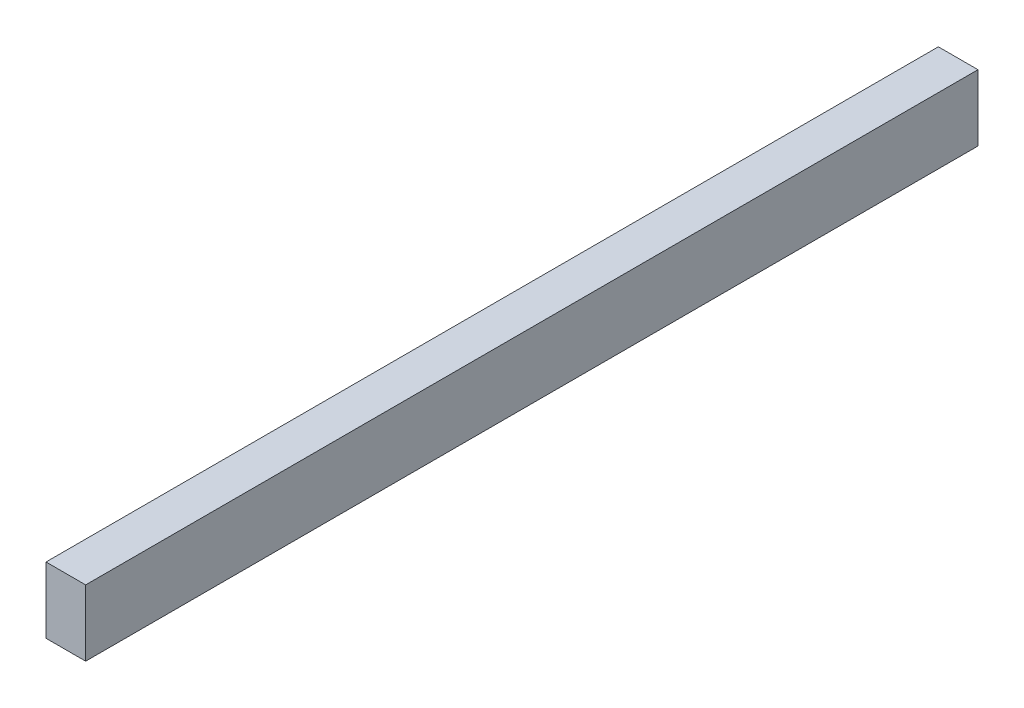
ISO-10303-21;
HEADER;
FILE_DESCRIPTION(('STEP AP214'),'2;1');
FILE_NAME('part.step','',(''),(''),'','','');
FILE_SCHEMA(('AUTOMOTIVE_DESIGN { 1 0 10303 214 1 1 1 1 }'));
ENDSEC;
DATA;
#1=APPLICATION_CONTEXT('core data for automotive mechanical design processes');
#2=APPLICATION_PROTOCOL_DEFINITION('international standard','automotive_design',2000,#1);
#3=PRODUCT_CONTEXT('',#1,'mechanical');
#4=PRODUCT('Part','Part','',(#3));
#5=PRODUCT_RELATED_PRODUCT_CATEGORY('part','',(#4));
#6=PRODUCT_DEFINITION_FORMATION('','',#4);
#7=PRODUCT_DEFINITION_CONTEXT('part definition',#1,'design');
#8=PRODUCT_DEFINITION('design','',#6,#7);
#9=PRODUCT_DEFINITION_SHAPE('','',#8);
#10=(LENGTH_UNIT() NAMED_UNIT(*) SI_UNIT(.MILLI.,.METRE.));
#11=(NAMED_UNIT(*) PLANE_ANGLE_UNIT() SI_UNIT($,.RADIAN.));
#12=(NAMED_UNIT(*) SI_UNIT($,.STERADIAN.) SOLID_ANGLE_UNIT());
#13=UNCERTAINTY_MEASURE_WITH_UNIT(LENGTH_MEASURE(1.E-05),#10,'distance_accuracy_value','');
#14=(GEOMETRIC_REPRESENTATION_CONTEXT(3) GLOBAL_UNCERTAINTY_ASSIGNED_CONTEXT((#13)) GLOBAL_UNIT_ASSIGNED_CONTEXT((#10,
#11,#12)) REPRESENTATION_CONTEXT('',''));
#15=CARTESIAN_POINT('',(0.,0.,0.));
#16=DIRECTION('',(0.,0.,1.));
#17=DIRECTION('',(1.,0.,0.));
#18=AXIS2_PLACEMENT_3D('',#15,#16,#17);
#19=CARTESIAN_POINT('',(-30.,1790.,-705.));
#20=DIRECTION('',(1.,0.,0.));
#21=DIRECTION('',(0.,1.,0.));
#22=AXIS2_PLACEMENT_3D('',#19,#20,#21);
#23=PLANE('',#22);
#24=DIRECTION('',(0.,0.,-1.));
#25=VECTOR('',#24,1.);
#26=CARTESIAN_POINT('',(-30.,1790.,-705.));
#27=LINE('',#26,#25);
#28=CARTESIAN_POINT('',(-30.,1790.,-705.));
#29=VERTEX_POINT('',#28);
#30=CARTESIAN_POINT('',(-30.,1790.,-2055.));
#31=VERTEX_POINT('',#30);
#32=EDGE_CURVE('E73',#29,#31,#27,.T.);
#33=ORIENTED_EDGE('',*,*,#32,.T.);
#34=DIRECTION('',(0.,-1.,0.));
#35=VECTOR('',#34,1.);
#36=CARTESIAN_POINT('',(-30.,1790.,-2055.));
#37=LINE('',#36,#35);
#38=CARTESIAN_POINT('',(-30.,1690.,-2055.));
#39=VERTEX_POINT('',#38);
#40=EDGE_CURVE('E69',#31,#39,#37,.T.);
#41=ORIENTED_EDGE('',*,*,#40,.T.);
#42=DIRECTION('',(0.,0.,-1.));
#43=VECTOR('',#42,1.);
#44=CARTESIAN_POINT('',(-30.,1690.,-705.));
#45=LINE('',#44,#43);
#46=CARTESIAN_POINT('',(-30.,1690.,-705.));
#47=VERTEX_POINT('',#46);
#48=EDGE_CURVE('E11',#47,#39,#45,.T.);
#49=ORIENTED_EDGE('',*,*,#48,.F.);
#50=DIRECTION('',(0.,-1.,0.));
#51=VECTOR('',#50,1.);
#52=CARTESIAN_POINT('',(-30.,1790.,-705.));
#53=LINE('',#52,#51);
#54=EDGE_CURVE('E81',#29,#47,#53,.T.);
#55=ORIENTED_EDGE('',*,*,#54,.F.);
#56=EDGE_LOOP('',(#33,#41,#49,#55));
#57=FACE_BOUND('',#56,.T.);
#58=ADVANCED_FACE('F17',(#57),#23,.F.);
#59=CARTESIAN_POINT('',(-30.,1690.,-705.));
#60=DIRECTION('',(0.,1.,0.));
#61=DIRECTION('',(-1.,0.,0.));
#62=AXIS2_PLACEMENT_3D('',#59,#60,#61);
#63=PLANE('',#62);
#64=ORIENTED_EDGE('',*,*,#48,.T.);
#65=DIRECTION('',(1.,0.,0.));
#66=VECTOR('',#65,1.);
#67=CARTESIAN_POINT('',(-30.,1690.,-2055.));
#68=LINE('',#67,#66);
#69=CARTESIAN_POINT('',(30.,1690.,-2055.));
#70=VERTEX_POINT('',#69);
#71=EDGE_CURVE('E59',#39,#70,#68,.T.);
#72=ORIENTED_EDGE('',*,*,#71,.T.);
#73=DIRECTION('',(0.,0.,-1.));
#74=VECTOR('',#73,1.);
#75=CARTESIAN_POINT('',(30.,1690.,-705.));
#76=LINE('',#75,#74);
#77=CARTESIAN_POINT('',(30.,1690.,-705.));
#78=VERTEX_POINT('',#77);
#79=EDGE_CURVE('E24',#78,#70,#76,.T.);
#80=ORIENTED_EDGE('',*,*,#79,.F.);
#81=DIRECTION('',(1.,0.,0.));
#82=VECTOR('',#81,1.);
#83=CARTESIAN_POINT('',(-30.,1690.,-705.));
#84=LINE('',#83,#82);
#85=EDGE_CURVE('E61',#47,#78,#84,.T.);
#86=ORIENTED_EDGE('',*,*,#85,.F.);
#87=EDGE_LOOP('',(#64,#72,#80,#86));
#88=FACE_BOUND('',#87,.T.);
#89=ADVANCED_FACE('F57',(#88),#63,.F.);
#90=CARTESIAN_POINT('',(30.,1690.,-705.));
#91=DIRECTION('',(-1.,0.,0.));
#92=DIRECTION('',(0.,-1.,0.));
#93=AXIS2_PLACEMENT_3D('',#90,#91,#92);
#94=PLANE('',#93);
#95=ORIENTED_EDGE('',*,*,#79,.T.);
#96=DIRECTION('',(0.,1.,0.));
#97=VECTOR('',#96,1.);
#98=CARTESIAN_POINT('',(30.,1690.,-2055.));
#99=LINE('',#98,#97);
#100=CARTESIAN_POINT('',(30.,1790.,-2055.));
#101=VERTEX_POINT('',#100);
#102=EDGE_CURVE('E71',#70,#101,#99,.T.);
#103=ORIENTED_EDGE('',*,*,#102,.T.);
#104=DIRECTION('',(0.,0.,-1.));
#105=VECTOR('',#104,1.);
#106=CARTESIAN_POINT('',(30.,1790.,-705.));
#107=LINE('',#106,#105);
#108=CARTESIAN_POINT('',(30.,1790.,-705.));
#109=VERTEX_POINT('',#108);
#110=EDGE_CURVE('E86',#109,#101,#107,.T.);
#111=ORIENTED_EDGE('',*,*,#110,.F.);
#112=DIRECTION('',(0.,1.,0.));
#113=VECTOR('',#112,1.);
#114=CARTESIAN_POINT('',(30.,1690.,-705.));
#115=LINE('',#114,#113);
#116=EDGE_CURVE('E36',#78,#109,#115,.T.);
#117=ORIENTED_EDGE('',*,*,#116,.F.);
#118=EDGE_LOOP('',(#95,#103,#111,#117));
#119=FACE_BOUND('',#118,.T.);
#120=ADVANCED_FACE('F88',(#119),#94,.F.);
#121=CARTESIAN_POINT('',(30.,1790.,-705.));
#122=DIRECTION('',(0.,-1.,0.));
#123=DIRECTION('',(1.,0.,0.));
#124=AXIS2_PLACEMENT_3D('',#121,#122,#123);
#125=PLANE('',#124);
#126=ORIENTED_EDGE('',*,*,#110,.T.);
#127=DIRECTION('',(-1.,0.,0.));
#128=VECTOR('',#127,1.);
#129=CARTESIAN_POINT('',(30.,1790.,-2055.));
#130=LINE('',#129,#128);
#131=EDGE_CURVE('E78',#101,#31,#130,.T.);
#132=ORIENTED_EDGE('',*,*,#131,.T.);
#133=ORIENTED_EDGE('',*,*,#32,.F.);
#134=DIRECTION('',(-1.,0.,0.));
#135=VECTOR('',#134,1.);
#136=CARTESIAN_POINT('',(30.,1790.,-705.));
#137=LINE('',#136,#135);
#138=EDGE_CURVE('E31',#109,#29,#137,.T.);
#139=ORIENTED_EDGE('',*,*,#138,.F.);
#140=EDGE_LOOP('',(#126,#132,#133,#139));
#141=FACE_BOUND('',#140,.T.);
#142=ADVANCED_FACE('F90',(#141),#125,.F.);
#143=CARTESIAN_POINT('',(-30.,1690.,-705.));
#144=DIRECTION('',(0.,0.,1.));
#145=DIRECTION('',(0.,-1.,0.));
#146=AXIS2_PLACEMENT_3D('',#143,#144,#145);
#147=PLANE('',#146);
#148=ORIENTED_EDGE('',*,*,#54,.T.);
#149=ORIENTED_EDGE('',*,*,#85,.T.);
#150=ORIENTED_EDGE('',*,*,#116,.T.);
#151=ORIENTED_EDGE('',*,*,#138,.T.);
#152=EDGE_LOOP('',(#148,#149,#150,#151));
#153=FACE_BOUND('',#152,.T.);
#154=ADVANCED_FACE('F91',(#153),#147,.T.);
#155=CARTESIAN_POINT('',(-30.,1690.,-2055.));
#156=DIRECTION('',(0.,0.,1.));
#157=DIRECTION('',(0.,-1.,0.));
#158=AXIS2_PLACEMENT_3D('',#155,#156,#157);
#159=PLANE('',#158);
#160=ORIENTED_EDGE('',*,*,#40,.F.);
#161=ORIENTED_EDGE('',*,*,#131,.F.);
#162=ORIENTED_EDGE('',*,*,#102,.F.);
#163=ORIENTED_EDGE('',*,*,#71,.F.);
#164=EDGE_LOOP('',(#160,#161,#162,#163));
#165=FACE_BOUND('',#164,.T.);
#166=ADVANCED_FACE('F67',(#165),#159,.F.);
#167=CLOSED_SHELL('',(#58,#89,#120,#142,#154,#166));
#168=MANIFOLD_SOLID_BREP('B1',#167);
#169=ADVANCED_BREP_SHAPE_REPRESENTATION('',(#18,#168),#14);
#170=SHAPE_DEFINITION_REPRESENTATION(#9,#169);
ENDSEC;
END-ISO-10303-21;
